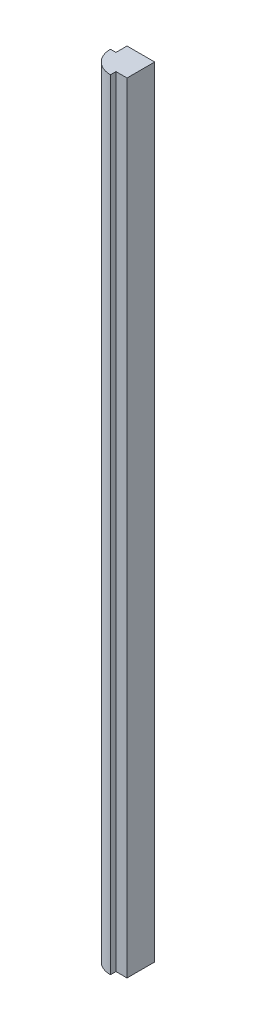
ISO-10303-21;
HEADER;
FILE_DESCRIPTION(('STEP AP214'),'2;1');
FILE_NAME('part.step','',(''),(''),'','','');
FILE_SCHEMA(('AUTOMOTIVE_DESIGN { 1 0 10303 214 1 1 1 1 }'));
ENDSEC;
DATA;
#1=APPLICATION_CONTEXT('core data for automotive mechanical design processes');
#2=APPLICATION_PROTOCOL_DEFINITION('international standard','automotive_design',2000,#1);
#3=PRODUCT_CONTEXT('',#1,'mechanical');
#4=PRODUCT('Part','Part','',(#3));
#5=PRODUCT_RELATED_PRODUCT_CATEGORY('part','',(#4));
#6=PRODUCT_DEFINITION_FORMATION('','',#4);
#7=PRODUCT_DEFINITION_CONTEXT('part definition',#1,'design');
#8=PRODUCT_DEFINITION('design','',#6,#7);
#9=PRODUCT_DEFINITION_SHAPE('','',#8);
#10=(LENGTH_UNIT() NAMED_UNIT(*) SI_UNIT(.MILLI.,.METRE.));
#11=(NAMED_UNIT(*) PLANE_ANGLE_UNIT() SI_UNIT($,.RADIAN.));
#12=(NAMED_UNIT(*) SI_UNIT($,.STERADIAN.) SOLID_ANGLE_UNIT());
#13=UNCERTAINTY_MEASURE_WITH_UNIT(LENGTH_MEASURE(1.E-05),#10,'distance_accuracy_value','');
#14=(GEOMETRIC_REPRESENTATION_CONTEXT(3) GLOBAL_UNCERTAINTY_ASSIGNED_CONTEXT((#13)) GLOBAL_UNIT_ASSIGNED_CONTEXT((#10,
#11,#12)) REPRESENTATION_CONTEXT('',''));
#15=CARTESIAN_POINT('',(0.,0.,0.));
#16=DIRECTION('',(0.,0.,1.));
#17=DIRECTION('',(1.,0.,0.));
#18=AXIS2_PLACEMENT_3D('',#15,#16,#17);
#19=CARTESIAN_POINT('',(0.,447.04,-12.7));
#20=DIRECTION('',(0.,0.,-1.));
#21=DIRECTION('',(-1.,0.,0.));
#22=AXIS2_PLACEMENT_3D('',#19,#20,#21);
#23=PLANE('',#22);
#24=DIRECTION('',(1.,0.,0.));
#25=VECTOR('',#24,1.);
#26=CARTESIAN_POINT('',(0.,0.,-12.7));
#27=LINE('',#26,#25);
#28=CARTESIAN_POINT('',(0.,0.,-12.7));
#29=VERTEX_POINT('',#28);
#30=CARTESIAN_POINT('',(3.175,0.,-12.7));
#31=VERTEX_POINT('',#30);
#32=EDGE_CURVE('E123',#29,#31,#27,.T.);
#33=ORIENTED_EDGE('',*,*,#32,.F.);
#34=DIRECTION('',(0.,-1.,0.));
#35=VECTOR('',#34,1.);
#36=CARTESIAN_POINT('',(0.,447.04,-12.7));
#37=LINE('',#36,#35);
#38=CARTESIAN_POINT('',(0.,447.04,-12.7));
#39=VERTEX_POINT('',#38);
#40=EDGE_CURVE('E11',#39,#29,#37,.T.);
#41=ORIENTED_EDGE('',*,*,#40,.F.);
#42=DIRECTION('',(1.,0.,0.));
#43=VECTOR('',#42,1.);
#44=CARTESIAN_POINT('',(0.,447.04,-12.7));
#45=LINE('',#44,#43);
#46=CARTESIAN_POINT('',(3.175,447.04,-12.7));
#47=VERTEX_POINT('',#46);
#48=EDGE_CURVE('E137',#39,#47,#45,.T.);
#49=ORIENTED_EDGE('',*,*,#48,.T.);
#50=DIRECTION('',(0.,-1.,0.));
#51=VECTOR('',#50,1.);
#52=CARTESIAN_POINT('',(3.175,447.04,-12.7));
#53=LINE('',#52,#51);
#54=EDGE_CURVE('E51',#47,#31,#53,.T.);
#55=ORIENTED_EDGE('',*,*,#54,.T.);
#56=EDGE_LOOP('',(#33,#41,#49,#55));
#57=FACE_BOUND('',#56,.T.);
#58=ADVANCED_FACE('F35',(#57),#23,.T.);
#59=CARTESIAN_POINT('',(12.7,447.04,-12.7));
#60=DIRECTION('',(0.,-1.,0.));
#61=DIRECTION('',(0.,0.,-1.));
#62=AXIS2_PLACEMENT_3D('',#59,#60,#61);
#63=CYLINDRICAL_SURFACE('',#62,12.7);
#64=CARTESIAN_POINT('',(12.7,0.,-12.7));
#65=DIRECTION('',(0.,1.,0.));
#66=DIRECTION('',(0.,0.,1.));
#67=AXIS2_PLACEMENT_3D('',#64,#65,#66);
#68=CIRCLE('',#67,12.7);
#69=CARTESIAN_POINT('',(12.7,0.,0.));
#70=VERTEX_POINT('',#69);
#71=EDGE_CURVE('E125',#29,#70,#68,.T.);
#72=ORIENTED_EDGE('',*,*,#71,.T.);
#73=DIRECTION('',(0.,-1.,0.));
#74=VECTOR('',#73,1.);
#75=CARTESIAN_POINT('',(12.7,447.04,0.));
#76=LINE('',#75,#74);
#77=CARTESIAN_POINT('',(12.7,447.04,0.));
#78=VERTEX_POINT('',#77);
#79=EDGE_CURVE('E43',#78,#70,#76,.T.);
#80=ORIENTED_EDGE('',*,*,#79,.F.);
#81=CARTESIAN_POINT('',(12.7,447.04,-12.7));
#82=DIRECTION('',(0.,1.,0.));
#83=DIRECTION('',(0.,0.,1.));
#84=AXIS2_PLACEMENT_3D('',#81,#82,#83);
#85=CIRCLE('',#84,12.7);
#86=EDGE_CURVE('E158',#39,#78,#85,.T.);
#87=ORIENTED_EDGE('',*,*,#86,.F.);
#88=ORIENTED_EDGE('',*,*,#40,.T.);
#89=EDGE_LOOP('',(#72,#80,#87,#88));
#90=FACE_BOUND('',#89,.T.);
#91=ADVANCED_FACE('F173',(#90),#63,.T.);
#92=CARTESIAN_POINT('',(12.7,447.04,0.));
#93=DIRECTION('',(-1.,0.,0.));
#94=DIRECTION('',(0.,0.,1.));
#95=AXIS2_PLACEMENT_3D('',#92,#93,#94);
#96=PLANE('',#95);
#97=DIRECTION('',(0.,0.,-1.));
#98=VECTOR('',#97,1.);
#99=CARTESIAN_POINT('',(12.7,0.,0.));
#100=LINE('',#99,#98);
#101=CARTESIAN_POINT('',(12.7,0.,-3.175));
#102=VERTEX_POINT('',#101);
#103=EDGE_CURVE('E127',#70,#102,#100,.T.);
#104=ORIENTED_EDGE('',*,*,#103,.T.);
#105=DIRECTION('',(0.,-1.,0.));
#106=VECTOR('',#105,1.);
#107=CARTESIAN_POINT('',(12.7,447.04,-3.175));
#108=LINE('',#107,#106);
#109=CARTESIAN_POINT('',(12.7,447.04,-3.175));
#110=VERTEX_POINT('',#109);
#111=EDGE_CURVE('E141',#110,#102,#108,.T.);
#112=ORIENTED_EDGE('',*,*,#111,.F.);
#113=DIRECTION('',(0.,0.,-1.));
#114=VECTOR('',#113,1.);
#115=CARTESIAN_POINT('',(12.7,447.04,0.));
#116=LINE('',#115,#114);
#117=EDGE_CURVE('E150',#78,#110,#116,.T.);
#118=ORIENTED_EDGE('',*,*,#117,.F.);
#119=ORIENTED_EDGE('',*,*,#79,.T.);
#120=EDGE_LOOP('',(#104,#112,#118,#119));
#121=FACE_BOUND('',#120,.T.);
#122=ADVANCED_FACE('F148',(#121),#96,.F.);
#123=CARTESIAN_POINT('',(0.,447.04,-3.175));
#124=DIRECTION('',(0.,0.,-1.));
#125=DIRECTION('',(-1.,0.,0.));
#126=AXIS2_PLACEMENT_3D('',#123,#124,#125);
#127=PLANE('',#126);
#128=DIRECTION('',(1.,0.,0.));
#129=VECTOR('',#128,1.);
#130=CARTESIAN_POINT('',(0.,0.,-3.175));
#131=LINE('',#130,#129);
#132=CARTESIAN_POINT('',(19.05,0.,-3.175));
#133=VERTEX_POINT('',#132);
#134=EDGE_CURVE('E129',#102,#133,#131,.T.);
#135=ORIENTED_EDGE('',*,*,#134,.T.);
#136=DIRECTION('',(0.,-1.,0.));
#137=VECTOR('',#136,1.);
#138=CARTESIAN_POINT('',(19.05,447.04,-3.175));
#139=LINE('',#138,#137);
#140=CARTESIAN_POINT('',(19.05,447.04,-3.175));
#141=VERTEX_POINT('',#140);
#142=EDGE_CURVE('E115',#141,#133,#139,.T.);
#143=ORIENTED_EDGE('',*,*,#142,.F.);
#144=DIRECTION('',(1.,0.,0.));
#145=VECTOR('',#144,1.);
#146=CARTESIAN_POINT('',(0.,447.04,-3.175));
#147=LINE('',#146,#145);
#148=EDGE_CURVE('E103',#110,#141,#147,.T.);
#149=ORIENTED_EDGE('',*,*,#148,.F.);
#150=ORIENTED_EDGE('',*,*,#111,.T.);
#151=EDGE_LOOP('',(#135,#143,#149,#150));
#152=FACE_BOUND('',#151,.T.);
#153=ADVANCED_FACE('F157',(#152),#127,.F.);
#154=CARTESIAN_POINT('',(19.05,447.04,0.));
#155=DIRECTION('',(-1.,0.,0.));
#156=DIRECTION('',(0.,0.,1.));
#157=AXIS2_PLACEMENT_3D('',#154,#155,#156);
#158=PLANE('',#157);
#159=DIRECTION('',(0.,0.,-1.));
#160=VECTOR('',#159,1.);
#161=CARTESIAN_POINT('',(19.05,0.,0.));
#162=LINE('',#161,#160);
#163=CARTESIAN_POINT('',(19.05,0.,-19.05));
#164=VERTEX_POINT('',#163);
#165=EDGE_CURVE('E112',#133,#164,#162,.T.);
#166=ORIENTED_EDGE('',*,*,#165,.T.);
#167=DIRECTION('',(0.,-1.,0.));
#168=VECTOR('',#167,1.);
#169=CARTESIAN_POINT('',(19.05,447.04,-19.05));
#170=LINE('',#169,#168);
#171=CARTESIAN_POINT('',(19.05,447.04,-19.05));
#172=VERTEX_POINT('',#171);
#173=EDGE_CURVE('E109',#172,#164,#170,.T.);
#174=ORIENTED_EDGE('',*,*,#173,.F.);
#175=DIRECTION('',(0.,0.,-1.));
#176=VECTOR('',#175,1.);
#177=CARTESIAN_POINT('',(19.05,447.04,0.));
#178=LINE('',#177,#176);
#179=EDGE_CURVE('E95',#141,#172,#178,.T.);
#180=ORIENTED_EDGE('',*,*,#179,.F.);
#181=ORIENTED_EDGE('',*,*,#142,.T.);
#182=EDGE_LOOP('',(#166,#174,#180,#181));
#183=FACE_BOUND('',#182,.T.);
#184=ADVANCED_FACE('F110',(#183),#158,.F.);
#185=CARTESIAN_POINT('',(0.,447.04,-19.05));
#186=DIRECTION('',(0.,0.,-1.));
#187=DIRECTION('',(-1.,0.,0.));
#188=AXIS2_PLACEMENT_3D('',#185,#186,#187);
#189=PLANE('',#188);
#190=DIRECTION('',(1.,0.,0.));
#191=VECTOR('',#190,1.);
#192=CARTESIAN_POINT('',(0.,0.,-19.05));
#193=LINE('',#192,#191);
#194=CARTESIAN_POINT('',(3.175,0.,-19.05));
#195=VERTEX_POINT('',#194);
#196=EDGE_CURVE('E132',#195,#164,#193,.T.);
#197=ORIENTED_EDGE('',*,*,#196,.F.);
#198=DIRECTION('',(0.,-1.,0.));
#199=VECTOR('',#198,1.);
#200=CARTESIAN_POINT('',(3.175,447.04,-19.05));
#201=LINE('',#200,#199);
#202=CARTESIAN_POINT('',(3.175,447.04,-19.05));
#203=VERTEX_POINT('',#202);
#204=EDGE_CURVE('E73',#203,#195,#201,.T.);
#205=ORIENTED_EDGE('',*,*,#204,.F.);
#206=DIRECTION('',(1.,0.,0.));
#207=VECTOR('',#206,1.);
#208=CARTESIAN_POINT('',(0.,447.04,-19.05));
#209=LINE('',#208,#207);
#210=EDGE_CURVE('E101',#203,#172,#209,.T.);
#211=ORIENTED_EDGE('',*,*,#210,.T.);
#212=ORIENTED_EDGE('',*,*,#173,.T.);
#213=EDGE_LOOP('',(#197,#205,#211,#212));
#214=FACE_BOUND('',#213,.T.);
#215=ADVANCED_FACE('F117',(#214),#189,.T.);
#216=CARTESIAN_POINT('',(3.175,447.04,0.));
#217=DIRECTION('',(-1.,0.,0.));
#218=DIRECTION('',(0.,0.,1.));
#219=AXIS2_PLACEMENT_3D('',#216,#217,#218);
#220=PLANE('',#219);
#221=DIRECTION('',(0.,0.,-1.));
#222=VECTOR('',#221,1.);
#223=CARTESIAN_POINT('',(3.175,0.,0.));
#224=LINE('',#223,#222);
#225=EDGE_CURVE('E134',#31,#195,#224,.T.);
#226=ORIENTED_EDGE('',*,*,#225,.F.);
#227=ORIENTED_EDGE('',*,*,#54,.F.);
#228=DIRECTION('',(0.,0.,-1.));
#229=VECTOR('',#228,1.);
#230=CARTESIAN_POINT('',(3.175,447.04,0.));
#231=LINE('',#230,#229);
#232=EDGE_CURVE('E118',#47,#203,#231,.T.);
#233=ORIENTED_EDGE('',*,*,#232,.T.);
#234=ORIENTED_EDGE('',*,*,#204,.T.);
#235=EDGE_LOOP('',(#226,#227,#233,#234));
#236=FACE_BOUND('',#235,.T.);
#237=ADVANCED_FACE('F162',(#236),#220,.T.);
#238=CARTESIAN_POINT('',(0.,447.04,0.));
#239=DIRECTION('',(0.,1.,0.));
#240=DIRECTION('',(0.,0.,1.));
#241=AXIS2_PLACEMENT_3D('',#238,#239,#240);
#242=PLANE('',#241);
#243=ORIENTED_EDGE('',*,*,#48,.F.);
#244=ORIENTED_EDGE('',*,*,#86,.T.);
#245=ORIENTED_EDGE('',*,*,#117,.T.);
#246=ORIENTED_EDGE('',*,*,#148,.T.);
#247=ORIENTED_EDGE('',*,*,#179,.T.);
#248=ORIENTED_EDGE('',*,*,#210,.F.);
#249=ORIENTED_EDGE('',*,*,#232,.F.);
#250=EDGE_LOOP('',(#243,#244,#245,#246,#247,#248,#249));
#251=FACE_BOUND('',#250,.T.);
#252=ADVANCED_FACE('F98',(#251),#242,.T.);
#253=CARTESIAN_POINT('',(0.,0.,0.));
#254=DIRECTION('',(0.,1.,0.));
#255=DIRECTION('',(0.,0.,1.));
#256=AXIS2_PLACEMENT_3D('',#253,#254,#255);
#257=PLANE('',#256);
#258=ORIENTED_EDGE('',*,*,#32,.T.);
#259=ORIENTED_EDGE('',*,*,#225,.T.);
#260=ORIENTED_EDGE('',*,*,#196,.T.);
#261=ORIENTED_EDGE('',*,*,#165,.F.);
#262=ORIENTED_EDGE('',*,*,#134,.F.);
#263=ORIENTED_EDGE('',*,*,#103,.F.);
#264=ORIENTED_EDGE('',*,*,#71,.F.);
#265=EDGE_LOOP('',(#258,#259,#260,#261,#262,#263,#264));
#266=FACE_BOUND('',#265,.T.);
#267=ADVANCED_FACE('F155',(#266),#257,.F.);
#268=CLOSED_SHELL('',(#58,#91,#122,#153,#184,#215,#237,#252,#267));
#269=MANIFOLD_SOLID_BREP('B2',#268);
#270=ADVANCED_BREP_SHAPE_REPRESENTATION('',(#18,#269),#14);
#271=SHAPE_DEFINITION_REPRESENTATION(#9,#270);
ENDSEC;
END-ISO-10303-21;
